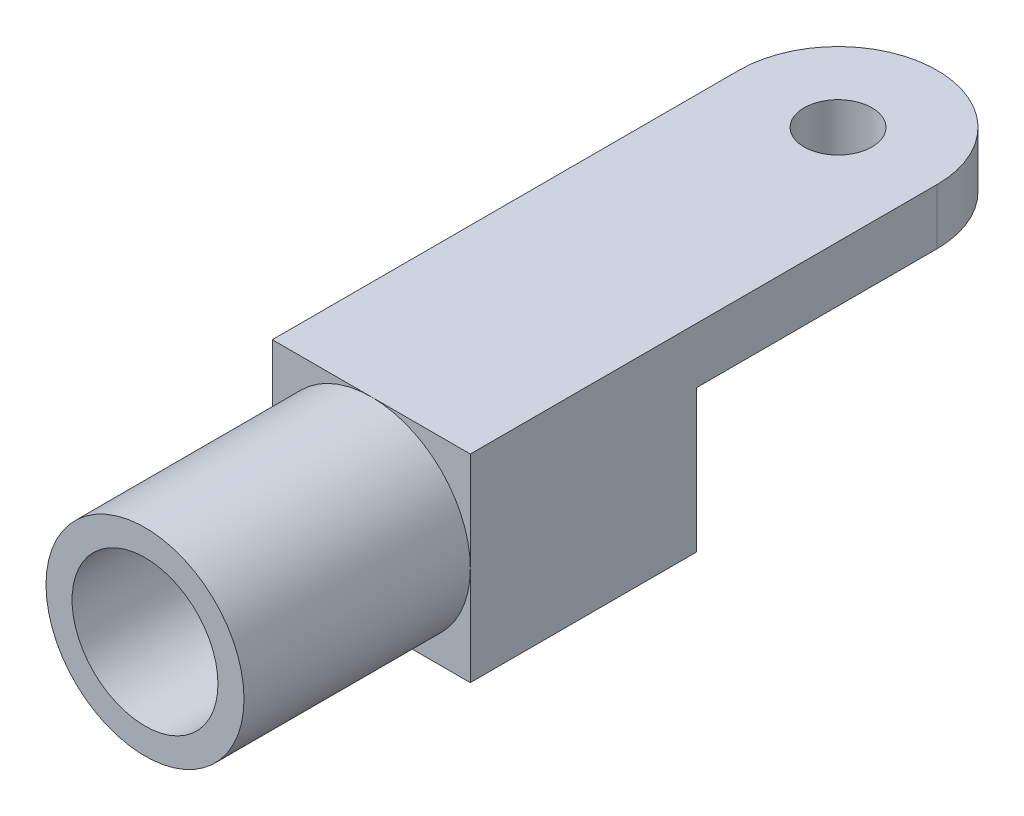
ISO-10303-21;
HEADER;
FILE_DESCRIPTION(('STEP AP214'),'2;1');
FILE_NAME('part.step','',(''),(''),'','','');
FILE_SCHEMA(('AUTOMOTIVE_DESIGN { 1 0 10303 214 1 1 1 1 }'));
ENDSEC;
DATA;
#1=APPLICATION_CONTEXT('core data for automotive mechanical design processes');
#2=APPLICATION_PROTOCOL_DEFINITION('international standard','automotive_design',2000,#1);
#3=PRODUCT_CONTEXT('',#1,'mechanical');
#4=PRODUCT('Part','Part','',(#3));
#5=PRODUCT_RELATED_PRODUCT_CATEGORY('part','',(#4));
#6=PRODUCT_DEFINITION_FORMATION('','',#4);
#7=PRODUCT_DEFINITION_CONTEXT('part definition',#1,'design');
#8=PRODUCT_DEFINITION('design','',#6,#7);
#9=PRODUCT_DEFINITION_SHAPE('','',#8);
#10=(LENGTH_UNIT() NAMED_UNIT(*) SI_UNIT(.MILLI.,.METRE.));
#11=(NAMED_UNIT(*) PLANE_ANGLE_UNIT() SI_UNIT($,.RADIAN.));
#12=(NAMED_UNIT(*) SI_UNIT($,.STERADIAN.) SOLID_ANGLE_UNIT());
#13=UNCERTAINTY_MEASURE_WITH_UNIT(LENGTH_MEASURE(1.E-05),#10,'distance_accuracy_value','');
#14=(GEOMETRIC_REPRESENTATION_CONTEXT(3) GLOBAL_UNCERTAINTY_ASSIGNED_CONTEXT((#13)) GLOBAL_UNIT_ASSIGNED_CONTEXT((#10,
#11,#12)) REPRESENTATION_CONTEXT('',''));
#15=CARTESIAN_POINT('',(0.,0.,0.));
#16=DIRECTION('',(0.,0.,1.));
#17=DIRECTION('',(1.,0.,0.));
#18=AXIS2_PLACEMENT_3D('',#15,#16,#17);
#19=CARTESIAN_POINT('',(4.445,-4.445,-25.4));
#20=DIRECTION('',(0.,1.,0.));
#21=DIRECTION('',(-1.,0.,0.));
#22=AXIS2_PLACEMENT_3D('',#19,#20,#21);
#23=PLANE('',#22);
#24=DIRECTION('',(0.,0.,1.));
#25=VECTOR('',#24,1.);
#26=CARTESIAN_POINT('',(-4.445,-4.445,-25.4));
#27=LINE('',#26,#25);
#28=CARTESIAN_POINT('',(-4.445,-4.445,-10.16));
#29=VERTEX_POINT('',#28);
#30=CARTESIAN_POINT('',(-4.445,-4.445,0.));
#31=VERTEX_POINT('',#30);
#32=EDGE_CURVE('E262',#29,#31,#27,.T.);
#33=ORIENTED_EDGE('',*,*,#32,.F.);
#34=DIRECTION('',(-1.,0.,0.));
#35=VECTOR('',#34,1.);
#36=CARTESIAN_POINT('',(4.445,-4.445,-10.16));
#37=LINE('',#36,#35);
#38=CARTESIAN_POINT('',(4.445,-4.445,-10.16));
#39=VERTEX_POINT('',#38);
#40=EDGE_CURVE('E197',#39,#29,#37,.T.);
#41=ORIENTED_EDGE('',*,*,#40,.F.);
#42=DIRECTION('',(0.,0.,1.));
#43=VECTOR('',#42,1.);
#44=CARTESIAN_POINT('',(4.445,-4.445,-25.4));
#45=LINE('',#44,#43);
#46=CARTESIAN_POINT('',(4.445,-4.445,0.));
#47=VERTEX_POINT('',#46);
#48=EDGE_CURVE('E211',#39,#47,#45,.T.);
#49=ORIENTED_EDGE('',*,*,#48,.T.);
#50=DIRECTION('',(-1.,0.,0.));
#51=VECTOR('',#50,1.);
#52=CARTESIAN_POINT('',(4.445,-4.445,0.));
#53=LINE('',#52,#51);
#54=CARTESIAN_POINT('',(0.,-4.445,0.));
#55=VERTEX_POINT('',#54);
#56=EDGE_CURVE('E242',#47,#55,#53,.T.);
#57=ORIENTED_EDGE('',*,*,#56,.T.);
#58=EDGE_CURVE('E241',#55,#31,#53,.T.);
#59=ORIENTED_EDGE('',*,*,#58,.T.);
#60=EDGE_LOOP('',(#33,#41,#49,#57,#59));
#61=FACE_BOUND('',#60,.T.);
#62=ADVANCED_FACE('F117',(#61),#23,.F.);
#63=CARTESIAN_POINT('',(4.445,4.445,-25.4));
#64=DIRECTION('',(0.,-1.,0.));
#65=DIRECTION('',(1.,0.,0.));
#66=AXIS2_PLACEMENT_3D('',#63,#64,#65);
#67=PLANE('',#66);
#68=CARTESIAN_POINT('',(0.,4.445,-20.955));
#69=DIRECTION('',(0.,-1.,0.));
#70=DIRECTION('',(0.,0.,-1.));
#71=AXIS2_PLACEMENT_3D('',#68,#69,#70);
#72=CIRCLE('',#71,1.524);
#73=CARTESIAN_POINT('',(0.,4.445,-22.479));
#74=VERTEX_POINT('',#73);
#75=EDGE_CURVE('E224',#74,#74,#72,.T.);
#76=ORIENTED_EDGE('',*,*,#75,.T.);
#77=EDGE_LOOP('',(#76));
#78=FACE_BOUND('',#77,.T.);
#79=DIRECTION('',(0.,0.,1.));
#80=VECTOR('',#79,1.);
#81=CARTESIAN_POINT('',(4.445,4.445,-25.4));
#82=LINE('',#81,#80);
#83=CARTESIAN_POINT('',(4.445,4.445,-20.955));
#84=VERTEX_POINT('',#83);
#85=CARTESIAN_POINT('',(4.445,4.445,0.));
#86=VERTEX_POINT('',#85);
#87=EDGE_CURVE('E256',#84,#86,#82,.T.);
#88=ORIENTED_EDGE('',*,*,#87,.F.);
#89=CARTESIAN_POINT('',(0.,4.445,-20.955));
#90=DIRECTION('',(0.,-1.,0.));
#91=DIRECTION('',(0.,0.,-1.));
#92=AXIS2_PLACEMENT_3D('',#89,#90,#91);
#93=CIRCLE('',#92,4.445);
#94=CARTESIAN_POINT('',(-4.445,4.445,-20.955));
#95=VERTEX_POINT('',#94);
#96=EDGE_CURVE('E231',#95,#84,#93,.T.);
#97=ORIENTED_EDGE('',*,*,#96,.F.);
#98=DIRECTION('',(0.,0.,1.));
#99=VECTOR('',#98,1.);
#100=CARTESIAN_POINT('',(-4.445,4.445,-25.4));
#101=LINE('',#100,#99);
#102=CARTESIAN_POINT('',(-4.445,4.445,0.));
#103=VERTEX_POINT('',#102);
#104=EDGE_CURVE('E259',#95,#103,#101,.T.);
#105=ORIENTED_EDGE('',*,*,#104,.T.);
#106=DIRECTION('',(1.,0.,0.));
#107=VECTOR('',#106,1.);
#108=CARTESIAN_POINT('',(4.445,4.445,0.));
#109=LINE('',#108,#107);
#110=CARTESIAN_POINT('',(0.,4.445,0.));
#111=VERTEX_POINT('',#110);
#112=EDGE_CURVE('E252',#103,#111,#109,.T.);
#113=ORIENTED_EDGE('',*,*,#112,.T.);
#114=EDGE_CURVE('E251',#111,#86,#109,.T.);
#115=ORIENTED_EDGE('',*,*,#114,.T.);
#116=EDGE_LOOP('',(#88,#97,#105,#113,#115));
#117=FACE_BOUND('',#116,.T.);
#118=ADVANCED_FACE('F319',(#78,#117),#67,.F.);
#119=CARTESIAN_POINT('',(4.445,4.445,-25.4));
#120=DIRECTION('',(-1.,0.,0.));
#121=DIRECTION('',(0.,-1.,0.));
#122=AXIS2_PLACEMENT_3D('',#119,#120,#121);
#123=PLANE('',#122);
#124=ORIENTED_EDGE('',*,*,#48,.F.);
#125=DIRECTION('',(0.,1.,0.));
#126=VECTOR('',#125,1.);
#127=CARTESIAN_POINT('',(4.445,-4.445,-10.16));
#128=LINE('',#127,#126);
#129=CARTESIAN_POINT('',(4.445,1.94564,-10.16));
#130=VERTEX_POINT('',#129);
#131=EDGE_CURVE('E190',#39,#130,#128,.T.);
#132=ORIENTED_EDGE('',*,*,#131,.T.);
#133=DIRECTION('',(0.,0.,-1.));
#134=VECTOR('',#133,1.);
#135=CARTESIAN_POINT('',(4.445,1.94564,-10.16));
#136=LINE('',#135,#134);
#137=CARTESIAN_POINT('',(4.445,1.94564,-20.955));
#138=VERTEX_POINT('',#137);
#139=EDGE_CURVE('E198',#130,#138,#136,.T.);
#140=ORIENTED_EDGE('',*,*,#139,.T.);
#141=DIRECTION('',(0.,-1.,0.));
#142=VECTOR('',#141,1.);
#143=CARTESIAN_POINT('',(4.445,4.445,-20.955));
#144=LINE('',#143,#142);
#145=EDGE_CURVE('E228',#84,#138,#144,.T.);
#146=ORIENTED_EDGE('',*,*,#145,.F.);
#147=ORIENTED_EDGE('',*,*,#87,.T.);
#148=DIRECTION('',(0.,-1.,0.));
#149=VECTOR('',#148,1.);
#150=CARTESIAN_POINT('',(4.445,4.445,0.));
#151=LINE('',#150,#149);
#152=CARTESIAN_POINT('',(4.445,0.,0.));
#153=VERTEX_POINT('',#152);
#154=EDGE_CURVE('E135',#86,#153,#151,.T.);
#155=ORIENTED_EDGE('',*,*,#154,.T.);
#156=EDGE_CURVE('E238',#153,#47,#151,.T.);
#157=ORIENTED_EDGE('',*,*,#156,.T.);
#158=EDGE_LOOP('',(#124,#132,#140,#146,#147,#155,#157));
#159=FACE_BOUND('',#158,.T.);
#160=ADVANCED_FACE('F210',(#159),#123,.F.);
#161=CARTESIAN_POINT('',(0.,0.,10.16));
#162=DIRECTION('',(0.,0.,1.));
#163=DIRECTION('',(1.,0.,0.));
#164=AXIS2_PLACEMENT_3D('',#161,#162,#163);
#165=PLANE('',#164);
#166=CARTESIAN_POINT('',(0.,0.,10.16));
#167=DIRECTION('',(0.,0.,1.));
#168=DIRECTION('',(1.,0.,0.));
#169=AXIS2_PLACEMENT_3D('',#166,#167,#168);
#170=CIRCLE('',#169,4.445);
#171=CARTESIAN_POINT('',(4.445,0.,10.16));
#172=VERTEX_POINT('',#171);
#173=EDGE_CURVE('E12',#172,#172,#170,.T.);
#174=ORIENTED_EDGE('',*,*,#173,.T.);
#175=EDGE_LOOP('',(#174));
#176=FACE_BOUND('',#175,.T.);
#177=CARTESIAN_POINT('',(0.,0.,10.16));
#178=DIRECTION('',(0.,0.,1.));
#179=DIRECTION('',(1.,0.,0.));
#180=AXIS2_PLACEMENT_3D('',#177,#178,#179);
#181=CIRCLE('',#180,3.2750000032);
#182=CARTESIAN_POINT('',(3.2750000032,0.,10.16));
#183=VERTEX_POINT('',#182);
#184=EDGE_CURVE('E268',#183,#183,#181,.T.);
#185=ORIENTED_EDGE('',*,*,#184,.F.);
#186=EDGE_LOOP('',(#185));
#187=FACE_BOUND('',#186,.T.);
#188=ADVANCED_FACE('F330',(#176,#187),#165,.T.);
#189=CARTESIAN_POINT('',(0.,0.,10.16));
#190=DIRECTION('',(0.,0.,-1.));
#191=DIRECTION('',(-1.,0.,0.));
#192=AXIS2_PLACEMENT_3D('',#189,#190,#191);
#193=CYLINDRICAL_SURFACE('',#192,4.445);
#194=ORIENTED_EDGE('',*,*,#173,.F.);
#195=EDGE_LOOP('',(#194));
#196=FACE_BOUND('',#195,.T.);
#197=CARTESIAN_POINT('',(0.,0.,0.));
#198=DIRECTION('',(0.,0.,1.));
#199=DIRECTION('',(1.,0.,0.));
#200=AXIS2_PLACEMENT_3D('',#197,#198,#199);
#201=CIRCLE('',#200,4.445);
#202=EDGE_CURVE('E127',#153,#111,#201,.T.);
#203=ORIENTED_EDGE('',*,*,#202,.T.);
#204=CARTESIAN_POINT('',(-4.445,0.,0.));
#205=VERTEX_POINT('',#204);
#206=EDGE_CURVE('E276',#111,#205,#201,.T.);
#207=ORIENTED_EDGE('',*,*,#206,.T.);
#208=EDGE_CURVE('E281',#205,#55,#201,.T.);
#209=ORIENTED_EDGE('',*,*,#208,.T.);
#210=EDGE_CURVE('E142',#55,#153,#201,.T.);
#211=ORIENTED_EDGE('',*,*,#210,.T.);
#212=EDGE_LOOP('',(#203,#207,#209,#211));
#213=FACE_BOUND('',#212,.T.);
#214=ADVANCED_FACE('F119',(#196,#213),#193,.T.);
#215=CARTESIAN_POINT('',(0.,0.,10.16));
#216=DIRECTION('',(0.,0.,-1.));
#217=DIRECTION('',(-1.,0.,0.));
#218=AXIS2_PLACEMENT_3D('',#215,#216,#217);
#219=CYLINDRICAL_SURFACE('',#218,3.2750000032);
#220=ORIENTED_EDGE('',*,*,#184,.T.);
#221=EDGE_LOOP('',(#220));
#222=FACE_BOUND('',#221,.T.);
#223=CARTESIAN_POINT('',(0.,0.,0.));
#224=DIRECTION('',(0.,0.,1.));
#225=DIRECTION('',(1.,0.,0.));
#226=AXIS2_PLACEMENT_3D('',#223,#224,#225);
#227=CIRCLE('',#226,3.2750000032);
#228=CARTESIAN_POINT('',(3.2750000032,0.,0.));
#229=VERTEX_POINT('',#228);
#230=EDGE_CURVE('E267',#229,#229,#227,.T.);
#231=ORIENTED_EDGE('',*,*,#230,.F.);
#232=EDGE_LOOP('',(#231));
#233=FACE_BOUND('',#232,.T.);
#234=ADVANCED_FACE('F331',(#222,#233),#219,.F.);
#235=CARTESIAN_POINT('',(0.,0.,0.));
#236=DIRECTION('',(0.,0.,-1.));
#237=DIRECTION('',(-1.,0.,0.));
#238=AXIS2_PLACEMENT_3D('',#235,#236,#237);
#239=PLANE('',#238);
#240=ORIENTED_EDGE('',*,*,#230,.T.);
#241=EDGE_LOOP('',(#240));
#242=FACE_BOUND('',#241,.T.);
#243=ADVANCED_FACE('F333',(#242),#239,.F.);
#244=ORIENTED_EDGE('',*,*,#202,.F.);
#245=ORIENTED_EDGE('',*,*,#154,.F.);
#246=ORIENTED_EDGE('',*,*,#114,.F.);
#247=EDGE_LOOP('',(#244,#245,#246));
#248=FACE_BOUND('',#247,.T.);
#249=ADVANCED_FACE('F348',(#248),#239,.F.);
#250=ORIENTED_EDGE('',*,*,#206,.F.);
#251=ORIENTED_EDGE('',*,*,#112,.F.);
#252=DIRECTION('',(0.,1.,0.));
#253=VECTOR('',#252,1.);
#254=CARTESIAN_POINT('',(-4.445,4.445,0.));
#255=LINE('',#254,#253);
#256=EDGE_CURVE('E246',#205,#103,#255,.T.);
#257=ORIENTED_EDGE('',*,*,#256,.F.);
#258=EDGE_LOOP('',(#250,#251,#257));
#259=FACE_BOUND('',#258,.T.);
#260=ADVANCED_FACE('F293',(#259),#239,.F.);
#261=ORIENTED_EDGE('',*,*,#208,.F.);
#262=EDGE_CURVE('E247',#31,#205,#255,.T.);
#263=ORIENTED_EDGE('',*,*,#262,.F.);
#264=ORIENTED_EDGE('',*,*,#58,.F.);
#265=EDGE_LOOP('',(#261,#263,#264));
#266=FACE_BOUND('',#265,.T.);
#267=ADVANCED_FACE('F288',(#266),#239,.F.);
#268=CARTESIAN_POINT('',(-4.445,4.445,-25.4));
#269=DIRECTION('',(1.,0.,0.));
#270=DIRECTION('',(0.,0.,-1.));
#271=AXIS2_PLACEMENT_3D('',#268,#269,#270);
#272=PLANE('',#271);
#273=DIRECTION('',(0.,0.,-1.));
#274=VECTOR('',#273,1.);
#275=CARTESIAN_POINT('',(-4.445,1.94564,-10.16));
#276=LINE('',#275,#274);
#277=CARTESIAN_POINT('',(-4.445,1.94564,-10.16));
#278=VERTEX_POINT('',#277);
#279=CARTESIAN_POINT('',(-4.445,1.94564,-20.955));
#280=VERTEX_POINT('',#279);
#281=EDGE_CURVE('E213',#278,#280,#276,.T.);
#282=ORIENTED_EDGE('',*,*,#281,.F.);
#283=DIRECTION('',(0.,1.,0.));
#284=VECTOR('',#283,1.);
#285=CARTESIAN_POINT('',(-4.445,-4.445,-10.16));
#286=LINE('',#285,#284);
#287=EDGE_CURVE('E193',#29,#278,#286,.T.);
#288=ORIENTED_EDGE('',*,*,#287,.F.);
#289=ORIENTED_EDGE('',*,*,#32,.T.);
#290=ORIENTED_EDGE('',*,*,#262,.T.);
#291=ORIENTED_EDGE('',*,*,#256,.T.);
#292=ORIENTED_EDGE('',*,*,#104,.F.);
#293=DIRECTION('',(0.,-1.,0.));
#294=VECTOR('',#293,1.);
#295=CARTESIAN_POINT('',(-4.445,4.445,-20.955));
#296=LINE('',#295,#294);
#297=EDGE_CURVE('E234',#95,#280,#296,.T.);
#298=ORIENTED_EDGE('',*,*,#297,.T.);
#299=EDGE_LOOP('',(#282,#288,#289,#290,#291,#292,#298));
#300=FACE_BOUND('',#299,.T.);
#301=ADVANCED_FACE('F298',(#300),#272,.F.);
#302=ORIENTED_EDGE('',*,*,#210,.F.);
#303=ORIENTED_EDGE('',*,*,#56,.F.);
#304=ORIENTED_EDGE('',*,*,#156,.F.);
#305=EDGE_LOOP('',(#302,#303,#304));
#306=FACE_BOUND('',#305,.T.);
#307=ADVANCED_FACE('F350',(#306),#239,.F.);
#308=CARTESIAN_POINT('',(0.,4.445,-20.955));
#309=DIRECTION('',(0.,-1.,0.));
#310=DIRECTION('',(0.,0.,-1.));
#311=AXIS2_PLACEMENT_3D('',#308,#309,#310);
#312=CYLINDRICAL_SURFACE('',#311,4.445);
#313=CARTESIAN_POINT('',(0.,1.94564,-20.955));
#314=DIRECTION('',(0.,1.,0.));
#315=DIRECTION('',(0.,0.,1.));
#316=AXIS2_PLACEMENT_3D('',#313,#314,#315);
#317=CIRCLE('',#316,4.445);
#318=EDGE_CURVE('E204',#280,#138,#317,.F.);
#319=ORIENTED_EDGE('',*,*,#318,.F.);
#320=ORIENTED_EDGE('',*,*,#297,.F.);
#321=ORIENTED_EDGE('',*,*,#96,.T.);
#322=ORIENTED_EDGE('',*,*,#145,.T.);
#323=EDGE_LOOP('',(#319,#320,#321,#322));
#324=FACE_BOUND('',#323,.T.);
#325=ADVANCED_FACE('F316',(#324),#312,.T.);
#326=CARTESIAN_POINT('',(0.,4.445,-20.955));
#327=DIRECTION('',(0.,-1.,0.));
#328=DIRECTION('',(0.,0.,-1.));
#329=AXIS2_PLACEMENT_3D('',#326,#327,#328);
#330=CYLINDRICAL_SURFACE('',#329,1.524);
#331=CARTESIAN_POINT('',(0.,1.94564,-20.955));
#332=DIRECTION('',(0.,1.,0.));
#333=DIRECTION('',(0.,0.,1.));
#334=AXIS2_PLACEMENT_3D('',#331,#332,#333);
#335=CIRCLE('',#334,1.524);
#336=CARTESIAN_POINT('',(0.,1.94564,-19.431));
#337=VERTEX_POINT('',#336);
#338=EDGE_CURVE('E121',#337,#337,#335,.F.);
#339=ORIENTED_EDGE('',*,*,#338,.T.);
#340=EDGE_LOOP('',(#339));
#341=FACE_BOUND('',#340,.T.);
#342=ORIENTED_EDGE('',*,*,#75,.F.);
#343=EDGE_LOOP('',(#342));
#344=FACE_BOUND('',#343,.T.);
#345=ADVANCED_FACE('F307',(#341,#344),#330,.F.);
#346=CARTESIAN_POINT('',(4.445,1.94564,-10.16));
#347=DIRECTION('',(0.,1.,0.));
#348=DIRECTION('',(0.,0.,1.));
#349=AXIS2_PLACEMENT_3D('',#346,#347,#348);
#350=PLANE('',#349);
#351=ORIENTED_EDGE('',*,*,#318,.T.);
#352=ORIENTED_EDGE('',*,*,#139,.F.);
#353=DIRECTION('',(-1.,0.,0.));
#354=VECTOR('',#353,1.);
#355=CARTESIAN_POINT('',(4.445,1.94564,-10.16));
#356=LINE('',#355,#354);
#357=EDGE_CURVE('E186',#130,#278,#356,.T.);
#358=ORIENTED_EDGE('',*,*,#357,.T.);
#359=ORIENTED_EDGE('',*,*,#281,.T.);
#360=EDGE_LOOP('',(#351,#352,#358,#359));
#361=FACE_BOUND('',#360,.T.);
#362=ORIENTED_EDGE('',*,*,#338,.F.);
#363=EDGE_LOOP('',(#362));
#364=FACE_BOUND('',#363,.T.);
#365=ADVANCED_FACE('F201',(#361,#364),#350,.F.);
#366=CARTESIAN_POINT('',(4.445,-4.445,-10.16));
#367=DIRECTION('',(0.,0.,1.));
#368=DIRECTION('',(0.,-1.,0.));
#369=AXIS2_PLACEMENT_3D('',#366,#367,#368);
#370=PLANE('',#369);
#371=ORIENTED_EDGE('',*,*,#287,.T.);
#372=ORIENTED_EDGE('',*,*,#357,.F.);
#373=ORIENTED_EDGE('',*,*,#131,.F.);
#374=ORIENTED_EDGE('',*,*,#40,.T.);
#375=EDGE_LOOP('',(#371,#372,#373,#374));
#376=FACE_BOUND('',#375,.T.);
#377=ADVANCED_FACE('F188',(#376),#370,.F.);
#378=CLOSED_SHELL('',(#62,#118,#160,#188,#214,#234,#243,#249,#260,#267,#301,#307,#325,#345,#365,#377));
#379=MANIFOLD_SOLID_BREP('B2',#378);
#380=ADVANCED_BREP_SHAPE_REPRESENTATION('',(#18,#379),#14);
#381=SHAPE_DEFINITION_REPRESENTATION(#9,#380);
ENDSEC;
END-ISO-10303-21;
